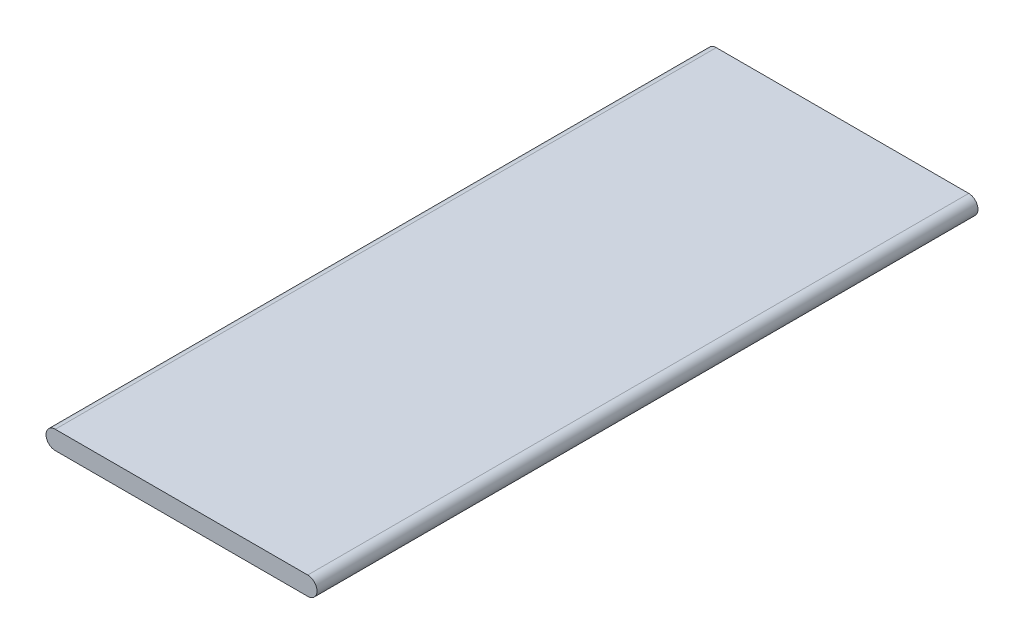
ISO-10303-21;
HEADER;
FILE_DESCRIPTION(('STEP AP214'),'2;1');
FILE_NAME('part.step','',(''),(''),'','','');
FILE_SCHEMA(('AUTOMOTIVE_DESIGN { 1 0 10303 214 1 1 1 1 }'));
ENDSEC;
DATA;
#1=APPLICATION_CONTEXT('core data for automotive mechanical design processes');
#2=APPLICATION_PROTOCOL_DEFINITION('international standard','automotive_design',2000,#1);
#3=PRODUCT_CONTEXT('',#1,'mechanical');
#4=PRODUCT('Part','Part','',(#3));
#5=PRODUCT_RELATED_PRODUCT_CATEGORY('part','',(#4));
#6=PRODUCT_DEFINITION_FORMATION('','',#4);
#7=PRODUCT_DEFINITION_CONTEXT('part definition',#1,'design');
#8=PRODUCT_DEFINITION('design','',#6,#7);
#9=PRODUCT_DEFINITION_SHAPE('','',#8);
#10=(LENGTH_UNIT() NAMED_UNIT(*) SI_UNIT(.MILLI.,.METRE.));
#11=(NAMED_UNIT(*) PLANE_ANGLE_UNIT() SI_UNIT($,.RADIAN.));
#12=(NAMED_UNIT(*) SI_UNIT($,.STERADIAN.) SOLID_ANGLE_UNIT());
#13=UNCERTAINTY_MEASURE_WITH_UNIT(LENGTH_MEASURE(1.E-05),#10,'distance_accuracy_value','');
#14=(GEOMETRIC_REPRESENTATION_CONTEXT(3) GLOBAL_UNCERTAINTY_ASSIGNED_CONTEXT((#13)) GLOBAL_UNIT_ASSIGNED_CONTEXT((#10,
#11,#12)) REPRESENTATION_CONTEXT('',''));
#15=CARTESIAN_POINT('',(0.,0.,0.));
#16=DIRECTION('',(0.,0.,1.));
#17=DIRECTION('',(1.,0.,0.));
#18=AXIS2_PLACEMENT_3D('',#15,#16,#17);
#19=CARTESIAN_POINT('',(-5.4072463768116,0.,49.9999999999999));
#20=DIRECTION('',(0.,0.,-1.));
#21=DIRECTION('',(-1.,0.,0.));
#22=AXIS2_PLACEMENT_3D('',#19,#20,#21);
#23=CYLINDRICAL_SURFACE('',#22,0.7);
#24=CARTESIAN_POINT('',(-5.4072463768116,0.,0.));
#25=DIRECTION('',(0.,0.,1.));
#26=DIRECTION('',(1.,0.,0.));
#27=AXIS2_PLACEMENT_3D('',#24,#25,#26);
#28=CIRCLE('',#27,0.7);
#29=CARTESIAN_POINT('',(-5.4072463768116,0.7,0.));
#30=VERTEX_POINT('',#29);
#31=CARTESIAN_POINT('',(-5.4072463768116,-0.7,0.));
#32=VERTEX_POINT('',#31);
#33=EDGE_CURVE('E102',#30,#32,#28,.T.);
#34=ORIENTED_EDGE('',*,*,#33,.T.);
#35=DIRECTION('',(0.,0.,-1.));
#36=VECTOR('',#35,1.);
#37=CARTESIAN_POINT('',(-5.4072463768116,-0.7,49.9999999999999));
#38=LINE('',#37,#36);
#39=CARTESIAN_POINT('',(-5.4072463768116,-0.7,49.9999999999999));
#40=VERTEX_POINT('',#39);
#41=EDGE_CURVE('E11',#40,#32,#38,.T.);
#42=ORIENTED_EDGE('',*,*,#41,.F.);
#43=CARTESIAN_POINT('',(-5.4072463768116,0.,49.9999999999999));
#44=DIRECTION('',(0.,0.,1.));
#45=DIRECTION('',(1.,0.,0.));
#46=AXIS2_PLACEMENT_3D('',#43,#44,#45);
#47=CIRCLE('',#46,0.7);
#48=CARTESIAN_POINT('',(-5.4072463768116,0.7,49.9999999999999));
#49=VERTEX_POINT('',#48);
#50=EDGE_CURVE('E90',#49,#40,#47,.T.);
#51=ORIENTED_EDGE('',*,*,#50,.F.);
#52=DIRECTION('',(0.,0.,-1.));
#53=VECTOR('',#52,1.);
#54=CARTESIAN_POINT('',(-5.4072463768116,0.7,49.9999999999999));
#55=LINE('',#54,#53);
#56=EDGE_CURVE('E98',#49,#30,#55,.T.);
#57=ORIENTED_EDGE('',*,*,#56,.T.);
#58=EDGE_LOOP('',(#34,#42,#51,#57));
#59=FACE_BOUND('',#58,.T.);
#60=ADVANCED_FACE('F39',(#59),#23,.T.);
#61=CARTESIAN_POINT('',(-5.4072463768116,-0.7,49.9999999999999));
#62=DIRECTION('',(0.,1.,0.));
#63=DIRECTION('',(0.,0.,1.));
#64=AXIS2_PLACEMENT_3D('',#61,#62,#63);
#65=PLANE('',#64);
#66=DIRECTION('',(1.,0.,0.));
#67=VECTOR('',#66,1.);
#68=CARTESIAN_POINT('',(-5.4072463768116,-0.7,0.));
#69=LINE('',#68,#67);
#70=CARTESIAN_POINT('',(13.6927536231884,-0.7,0.));
#71=VERTEX_POINT('',#70);
#72=EDGE_CURVE('E94',#32,#71,#69,.T.);
#73=ORIENTED_EDGE('',*,*,#72,.T.);
#74=DIRECTION('',(0.,0.,-1.));
#75=VECTOR('',#74,1.);
#76=CARTESIAN_POINT('',(13.6927536231884,-0.7,49.9999999999999));
#77=LINE('',#76,#75);
#78=CARTESIAN_POINT('',(13.6927536231884,-0.7,49.9999999999999));
#79=VERTEX_POINT('',#78);
#80=EDGE_CURVE('E47',#79,#71,#77,.T.);
#81=ORIENTED_EDGE('',*,*,#80,.F.);
#82=DIRECTION('',(1.,0.,0.));
#83=VECTOR('',#82,1.);
#84=CARTESIAN_POINT('',(-5.4072463768116,-0.7,49.9999999999999));
#85=LINE('',#84,#83);
#86=EDGE_CURVE('E85',#40,#79,#85,.T.);
#87=ORIENTED_EDGE('',*,*,#86,.F.);
#88=ORIENTED_EDGE('',*,*,#41,.T.);
#89=EDGE_LOOP('',(#73,#81,#87,#88));
#90=FACE_BOUND('',#89,.T.);
#91=ADVANCED_FACE('F93',(#90),#65,.F.);
#92=CARTESIAN_POINT('',(13.6927536231884,0.,49.9999999999999));
#93=DIRECTION('',(0.,0.,-1.));
#94=DIRECTION('',(-1.,0.,0.));
#95=AXIS2_PLACEMENT_3D('',#92,#93,#94);
#96=CYLINDRICAL_SURFACE('',#95,0.7);
#97=CARTESIAN_POINT('',(13.6927536231884,0.,0.));
#98=DIRECTION('',(0.,0.,1.));
#99=DIRECTION('',(1.,0.,0.));
#100=AXIS2_PLACEMENT_3D('',#97,#98,#99);
#101=CIRCLE('',#100,0.7);
#102=CARTESIAN_POINT('',(13.6927536231884,0.7,0.));
#103=VERTEX_POINT('',#102);
#104=EDGE_CURVE('E72',#71,#103,#101,.T.);
#105=ORIENTED_EDGE('',*,*,#104,.T.);
#106=DIRECTION('',(0.,0.,-1.));
#107=VECTOR('',#106,1.);
#108=CARTESIAN_POINT('',(13.6927536231884,0.7,49.9999999999999));
#109=LINE('',#108,#107);
#110=CARTESIAN_POINT('',(13.6927536231884,0.7,49.9999999999999));
#111=VERTEX_POINT('',#110);
#112=EDGE_CURVE('E95',#111,#103,#109,.T.);
#113=ORIENTED_EDGE('',*,*,#112,.F.);
#114=CARTESIAN_POINT('',(13.6927536231884,0.,49.9999999999999));
#115=DIRECTION('',(0.,0.,1.));
#116=DIRECTION('',(1.,0.,0.));
#117=AXIS2_PLACEMENT_3D('',#114,#115,#116);
#118=CIRCLE('',#117,0.7);
#119=EDGE_CURVE('E88',#79,#111,#118,.T.);
#120=ORIENTED_EDGE('',*,*,#119,.F.);
#121=ORIENTED_EDGE('',*,*,#80,.T.);
#122=EDGE_LOOP('',(#105,#113,#120,#121));
#123=FACE_BOUND('',#122,.T.);
#124=ADVANCED_FACE('F96',(#123),#96,.T.);
#125=CARTESIAN_POINT('',(-5.4072463768116,0.7,49.9999999999999));
#126=DIRECTION('',(0.,-1.,0.));
#127=DIRECTION('',(0.,0.,-1.));
#128=AXIS2_PLACEMENT_3D('',#125,#126,#127);
#129=PLANE('',#128);
#130=DIRECTION('',(-1.,0.,0.));
#131=VECTOR('',#130,1.);
#132=CARTESIAN_POINT('',(-5.4072463768116,0.7,0.));
#133=LINE('',#132,#131);
#134=EDGE_CURVE('E78',#103,#30,#133,.T.);
#135=ORIENTED_EDGE('',*,*,#134,.T.);
#136=ORIENTED_EDGE('',*,*,#56,.F.);
#137=DIRECTION('',(-1.,0.,0.));
#138=VECTOR('',#137,1.);
#139=CARTESIAN_POINT('',(-5.4072463768116,0.7,49.9999999999999));
#140=LINE('',#139,#138);
#141=EDGE_CURVE('E55',#111,#49,#140,.T.);
#142=ORIENTED_EDGE('',*,*,#141,.F.);
#143=ORIENTED_EDGE('',*,*,#112,.T.);
#144=EDGE_LOOP('',(#135,#136,#142,#143));
#145=FACE_BOUND('',#144,.T.);
#146=ADVANCED_FACE('F109',(#145),#129,.F.);
#147=CARTESIAN_POINT('',(-5.4072463768116,0.,49.9999999999999));
#148=DIRECTION('',(0.,0.,1.));
#149=DIRECTION('',(1.,0.,0.));
#150=AXIS2_PLACEMENT_3D('',#147,#148,#149);
#151=PLANE('',#150);
#152=ORIENTED_EDGE('',*,*,#50,.T.);
#153=ORIENTED_EDGE('',*,*,#86,.T.);
#154=ORIENTED_EDGE('',*,*,#119,.T.);
#155=ORIENTED_EDGE('',*,*,#141,.T.);
#156=EDGE_LOOP('',(#152,#153,#154,#155));
#157=FACE_BOUND('',#156,.T.);
#158=ADVANCED_FACE('F86',(#157),#151,.T.);
#159=CARTESIAN_POINT('',(-5.4072463768116,0.,0.));
#160=DIRECTION('',(0.,0.,1.));
#161=DIRECTION('',(1.,0.,0.));
#162=AXIS2_PLACEMENT_3D('',#159,#160,#161);
#163=PLANE('',#162);
#164=ORIENTED_EDGE('',*,*,#33,.F.);
#165=ORIENTED_EDGE('',*,*,#134,.F.);
#166=ORIENTED_EDGE('',*,*,#104,.F.);
#167=ORIENTED_EDGE('',*,*,#72,.F.);
#168=EDGE_LOOP('',(#164,#165,#166,#167));
#169=FACE_BOUND('',#168,.T.);
#170=ADVANCED_FACE('F112',(#169),#163,.F.);
#171=CLOSED_SHELL('',(#60,#91,#124,#146,#158,#170));
#172=MANIFOLD_SOLID_BREP('B2',#171);
#173=ADVANCED_BREP_SHAPE_REPRESENTATION('',(#18,#172),#14);
#174=SHAPE_DEFINITION_REPRESENTATION(#9,#173);
ENDSEC;
END-ISO-10303-21;
